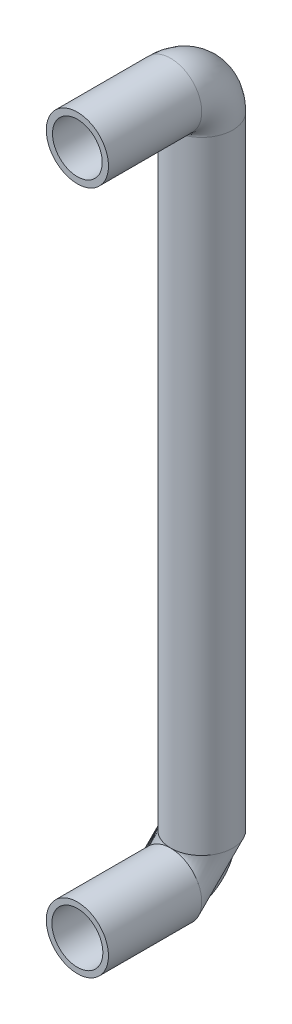
ISO-10303-21;
HEADER;
FILE_DESCRIPTION(('STEP AP214'),'2;1');
FILE_NAME('part.step','',(''),(''),'','','');
FILE_SCHEMA(('AUTOMOTIVE_DESIGN { 1 0 10303 214 1 1 1 1 }'));
ENDSEC;
DATA;
#1=APPLICATION_CONTEXT('core data for automotive mechanical design processes');
#2=APPLICATION_PROTOCOL_DEFINITION('international standard','automotive_design',2000,#1);
#3=PRODUCT_CONTEXT('',#1,'mechanical');
#4=PRODUCT('Part','Part','',(#3));
#5=PRODUCT_RELATED_PRODUCT_CATEGORY('part','',(#4));
#6=PRODUCT_DEFINITION_FORMATION('','',#4);
#7=PRODUCT_DEFINITION_CONTEXT('part definition',#1,'design');
#8=PRODUCT_DEFINITION('design','',#6,#7);
#9=PRODUCT_DEFINITION_SHAPE('','',#8);
#10=(LENGTH_UNIT() NAMED_UNIT(*) SI_UNIT(.MILLI.,.METRE.));
#11=(NAMED_UNIT(*) PLANE_ANGLE_UNIT() SI_UNIT($,.RADIAN.));
#12=(NAMED_UNIT(*) SI_UNIT($,.STERADIAN.) SOLID_ANGLE_UNIT());
#13=UNCERTAINTY_MEASURE_WITH_UNIT(LENGTH_MEASURE(1.E-05),#10,'distance_accuracy_value','');
#14=(GEOMETRIC_REPRESENTATION_CONTEXT(3) GLOBAL_UNCERTAINTY_ASSIGNED_CONTEXT((#13)) GLOBAL_UNIT_ASSIGNED_CONTEXT((#10,
#11,#12)) REPRESENTATION_CONTEXT('',''));
#15=CARTESIAN_POINT('',(0.,0.,0.));
#16=DIRECTION('',(0.,0.,1.));
#17=DIRECTION('',(1.,0.,0.));
#18=AXIS2_PLACEMENT_3D('',#15,#16,#17);
#19=CARTESIAN_POINT('',(0.,0.,0.));
#20=DIRECTION('',(0.,0.,1.));
#21=DIRECTION('',(1.,0.,0.));
#22=AXIS2_PLACEMENT_3D('',#19,#20,#21);
#23=PLANE('',#22);
#24=CARTESIAN_POINT('',(0.,0.,0.));
#25=DIRECTION('',(0.,0.,1.));
#26=DIRECTION('',(1.,0.,0.));
#27=AXIS2_PLACEMENT_3D('',#24,#25,#26);
#28=CIRCLE('',#27,4.);
#29=CARTESIAN_POINT('',(4.,0.,0.));
#30=VERTEX_POINT('',#29);
#31=EDGE_CURVE('E77',#30,#30,#28,.T.);
#32=ORIENTED_EDGE('',*,*,#31,.F.);
#33=EDGE_LOOP('',(#32));
#34=FACE_BOUND('',#33,.T.);
#35=CARTESIAN_POINT('',(0.,0.,0.));
#36=DIRECTION('',(0.,0.,1.));
#37=DIRECTION('',(1.,0.,0.));
#38=AXIS2_PLACEMENT_3D('',#35,#36,#37);
#39=CIRCLE('',#38,5.);
#40=CARTESIAN_POINT('',(5.,0.,0.));
#41=VERTEX_POINT('',#40);
#42=EDGE_CURVE('E88',#41,#41,#39,.T.);
#43=ORIENTED_EDGE('',*,*,#42,.T.);
#44=EDGE_LOOP('',(#43));
#45=FACE_BOUND('',#44,.T.);
#46=ADVANCED_FACE('F39',(#34,#45),#23,.T.);
#47=CARTESIAN_POINT('',(0.,-110.,0.));
#48=DIRECTION('',(0.,0.,-1.));
#49=DIRECTION('',(1.,0.,0.));
#50=AXIS2_PLACEMENT_3D('',#47,#48,#49);
#51=PLANE('',#50);
#52=CARTESIAN_POINT('',(0.,-110.,0.));
#53=DIRECTION('',(0.,0.,1.));
#54=DIRECTION('',(1.,0.,0.));
#55=AXIS2_PLACEMENT_3D('',#52,#53,#54);
#56=CIRCLE('',#55,4.1);
#57=CARTESIAN_POINT('',(4.1,-110.,0.));
#58=VERTEX_POINT('',#57);
#59=EDGE_CURVE('E78',#58,#58,#56,.T.);
#60=ORIENTED_EDGE('',*,*,#59,.F.);
#61=EDGE_LOOP('',(#60));
#62=FACE_BOUND('',#61,.T.);
#63=CARTESIAN_POINT('',(0.,-110.,0.));
#64=DIRECTION('',(0.,0.,-1.));
#65=DIRECTION('',(1.,0.,0.));
#66=AXIS2_PLACEMENT_3D('',#63,#64,#65);
#67=CIRCLE('',#66,5.);
#68=CARTESIAN_POINT('',(5.,-110.,0.));
#69=VERTEX_POINT('',#68);
#70=EDGE_CURVE('E73',#69,#69,#67,.T.);
#71=ORIENTED_EDGE('',*,*,#70,.F.);
#72=EDGE_LOOP('',(#71));
#73=FACE_BOUND('',#72,.T.);
#74=ADVANCED_FACE('F148',(#62,#73),#51,.F.);
#75=CARTESIAN_POINT('',(0.,0.,0.));
#76=DIRECTION('',(0.,0.,-1.));
#77=DIRECTION('',(-1.,0.,0.));
#78=AXIS2_PLACEMENT_3D('',#75,#76,#77);
#79=CYLINDRICAL_SURFACE('',#78,5.);
#80=CARTESIAN_POINT('',(0.,0.,-15.));
#81=DIRECTION('',(0.,0.,1.));
#82=DIRECTION('',(1.,0.,0.));
#83=AXIS2_PLACEMENT_3D('',#80,#81,#82);
#84=CIRCLE('',#83,5.);
#85=CARTESIAN_POINT('',(0.,-5.,-15.));
#86=VERTEX_POINT('',#85);
#87=EDGE_CURVE('E64',#86,#86,#84,.T.);
#88=ORIENTED_EDGE('',*,*,#87,.T.);
#89=EDGE_LOOP('',(#88));
#90=FACE_BOUND('',#89,.T.);
#91=ORIENTED_EDGE('',*,*,#42,.F.);
#92=EDGE_LOOP('',(#91));
#93=FACE_BOUND('',#92,.T.);
#94=ADVANCED_FACE('F150',(#90,#93),#79,.T.);
#95=CARTESIAN_POINT('',(0.,-5.,-9.99999999999999));
#96=DIRECTION('',(0.,-1.,0.));
#97=DIRECTION('',(0.,0.,1.));
#98=AXIS2_PLACEMENT_3D('',#95,#96,#97);
#99=CIRCLE('',#98,5.);
#100=TRIMMED_CURVE('',#99,(PARAMETER_VALUE(-3.14159263251637)),
(PARAMETER_VALUE(3.14159263251637)),.T.,.PARAMETER.);
#101=CARTESIAN_POINT('',(0.,-5.,-15.));
#102=DIRECTION('',(-1.,0.,0.));
#103=AXIS1_PLACEMENT('',#101,#102);
#104=SURFACE_OF_REVOLUTION('',#100,#103);
#105=CARTESIAN_POINT('',(0.,-5.00000000000003,-20.));
#106=DIRECTION('',(0.,1.,0.));
#107=DIRECTION('',(1.,0.,0.));
#108=AXIS2_PLACEMENT_3D('',#105,#106,#107);
#109=CIRCLE('',#108,5.);
#110=EDGE_CURVE('E103',#86,#86,#109,.T.);
#111=ORIENTED_EDGE('',*,*,#110,.T.);
#112=ORIENTED_EDGE('',*,*,#87,.F.);
#113=EDGE_LOOP('',(#111,#112));
#114=FACE_BOUND('',#113,.T.);
#115=ADVANCED_FACE('F156',(#114),#104,.T.);
#116=CARTESIAN_POINT('',(0.,-5.00000000000003,-20.));
#117=DIRECTION('',(0.,-1.,0.));
#118=DIRECTION('',(0.,0.,-1.));
#119=AXIS2_PLACEMENT_3D('',#116,#117,#118);
#120=CYLINDRICAL_SURFACE('',#119,5.);
#121=CARTESIAN_POINT('',(0.,-105.,-20.));
#122=DIRECTION('',(0.,1.,0.));
#123=DIRECTION('',(1.,0.,0.));
#124=AXIS2_PLACEMENT_3D('',#121,#122,#123);
#125=CIRCLE('',#124,5.);
#126=CARTESIAN_POINT('',(0.,-105.,-15.));
#127=VERTEX_POINT('',#126);
#128=EDGE_CURVE('E105',#127,#127,#125,.T.);
#129=ORIENTED_EDGE('',*,*,#128,.T.);
#130=EDGE_LOOP('',(#129));
#131=FACE_BOUND('',#130,.T.);
#132=ORIENTED_EDGE('',*,*,#110,.F.);
#133=EDGE_LOOP('',(#132));
#134=FACE_BOUND('',#133,.T.);
#135=ADVANCED_FACE('F143',(#131,#134),#120,.T.);
#136=CARTESIAN_POINT('',(0.,-105.,-15.));
#137=DIRECTION('',(-1.,0.,0.));
#138=DIRECTION('',(0.,0.,1.));
#139=AXIS2_PLACEMENT_3D('',#136,#137,#138);
#140=TOROIDAL_SURFACE('',#139,5.,5.);
#141=CARTESIAN_POINT('',(0.,-110.,-15.));
#142=DIRECTION('',(0.,0.,-1.));
#143=DIRECTION('',(1.,0.,0.));
#144=AXIS2_PLACEMENT_3D('',#141,#142,#143);
#145=CIRCLE('',#144,5.);
#146=EDGE_CURVE('E108',#127,#127,#145,.T.);
#147=ORIENTED_EDGE('',*,*,#146,.T.);
#148=ORIENTED_EDGE('',*,*,#128,.F.);
#149=EDGE_LOOP('',(#147,#148));
#150=FACE_BOUND('',#149,.T.);
#151=ADVANCED_FACE('F137',(#150),#140,.T.);
#152=CARTESIAN_POINT('',(0.,-110.,-15.));
#153=DIRECTION('',(0.,0.,1.));
#154=DIRECTION('',(1.,0.,0.));
#155=AXIS2_PLACEMENT_3D('',#152,#153,#154);
#156=CYLINDRICAL_SURFACE('',#155,5.);
#157=ORIENTED_EDGE('',*,*,#70,.T.);
#158=EDGE_LOOP('',(#157));
#159=FACE_BOUND('',#158,.T.);
#160=ORIENTED_EDGE('',*,*,#146,.F.);
#161=EDGE_LOOP('',(#160));
#162=FACE_BOUND('',#161,.T.);
#163=ADVANCED_FACE('F128',(#159,#162),#156,.T.);
#164=CARTESIAN_POINT('',(0.,0.,0.));
#165=DIRECTION('',(0.,0.,-1.));
#166=DIRECTION('',(-1.,0.,0.));
#167=AXIS2_PLACEMENT_3D('',#164,#165,#166);
#168=CYLINDRICAL_SURFACE('',#167,4.);
#169=CARTESIAN_POINT('',(0.,0.,-15.));
#170=DIRECTION('',(0.,0.,-1.));
#171=DIRECTION('',(-1.,0.,0.));
#172=AXIS2_PLACEMENT_3D('',#169,#170,#171);
#173=CIRCLE('',#172,4.);
#174=CARTESIAN_POINT('',(0.,4.,-15.));
#175=VERTEX_POINT('',#174);
#176=EDGE_CURVE('E94',#175,#175,#173,.F.);
#177=ORIENTED_EDGE('',*,*,#176,.F.);
#178=EDGE_LOOP('',(#177));
#179=FACE_BOUND('',#178,.T.);
#180=ORIENTED_EDGE('',*,*,#31,.T.);
#181=EDGE_LOOP('',(#180));
#182=FACE_BOUND('',#181,.T.);
#183=ADVANCED_FACE('F124',(#179,#182),#168,.F.);
#184=CARTESIAN_POINT('',(0.,-5.,-15.));
#185=DIRECTION('',(-1.,0.,0.));
#186=DIRECTION('',(0.,0.,1.));
#187=AXIS2_PLACEMENT_3D('',#184,#185,#186);
#188=TOROIDAL_SURFACE('',#187,5.,4.);
#189=CARTESIAN_POINT('',(0.,-5.00000000000003,-20.));
#190=DIRECTION('',(0.,1.,0.));
#191=DIRECTION('',(0.,0.,1.));
#192=AXIS2_PLACEMENT_3D('',#189,#190,#191);
#193=CIRCLE('',#192,4.);
#194=CARTESIAN_POINT('',(0.,-5.00000000000006,-24.));
#195=VERTEX_POINT('',#194);
#196=EDGE_CURVE('E89',#195,#195,#193,.T.);
#197=CARTESIAN_POINT('',(0.,-5.,-15.));
#198=DIRECTION('',(-1.,0.,0.));
#199=DIRECTION('',(0.,0.,1.));
#200=AXIS2_PLACEMENT_3D('',#197,#198,#199);
#201=CIRCLE('',#200,9.);
#202=EDGE_CURVE('',#175,#195,#201,.T.);
#203=ORIENTED_EDGE('',*,*,#176,.T.);
#204=ORIENTED_EDGE('',*,*,#196,.F.);
#205=ORIENTED_EDGE('',*,*,#202,.T.);
#206=ORIENTED_EDGE('',*,*,#202,.F.);
#207=EDGE_LOOP('',(#203,#205,#204,#206));
#208=FACE_BOUND('',#207,.T.);
#209=ADVANCED_FACE('F127',(#208),#188,.F.);
#210=CARTESIAN_POINT('',(0.,-5.00000000000003,-20.));
#211=DIRECTION('',(0.,-1.,0.));
#212=DIRECTION('',(0.,0.,-1.));
#213=AXIS2_PLACEMENT_3D('',#210,#211,#212);
#214=CYLINDRICAL_SURFACE('',#213,4.);
#215=CARTESIAN_POINT('',(0.,-105.,-20.));
#216=DIRECTION('',(0.,-1.,0.));
#217=DIRECTION('',(0.,0.,-1.));
#218=AXIS2_PLACEMENT_3D('',#215,#216,#217);
#219=CIRCLE('',#218,4.);
#220=CARTESIAN_POINT('',(0.,-105.,-24.));
#221=VERTEX_POINT('',#220);
#222=EDGE_CURVE('E86',#221,#221,#219,.F.);
#223=ORIENTED_EDGE('',*,*,#222,.F.);
#224=EDGE_LOOP('',(#223));
#225=FACE_BOUND('',#224,.T.);
#226=ORIENTED_EDGE('',*,*,#196,.T.);
#227=EDGE_LOOP('',(#226));
#228=FACE_BOUND('',#227,.T.);
#229=ADVANCED_FACE('F83',(#225,#228),#214,.F.);
#230=CARTESIAN_POINT('',(0.,-105.,-15.));
#231=DIRECTION('',(-1.,0.,0.));
#232=DIRECTION('',(0.,0.,1.));
#233=AXIS2_PLACEMENT_3D('',#230,#231,#232);
#234=TOROIDAL_SURFACE('',#233,5.,4.);
#235=CARTESIAN_POINT('',(-3.95454413177491,-108.917604180605,-17.0002));
#236=CARTESIAN_POINT('',(-3.94818848563866,-108.89438807795,-16.953642394314));
#237=CARTESIAN_POINT('',(-3.94095379089389,-108.86875336566,-16.9084355831934));
#238=CARTESIAN_POINT('',(-3.92460820201643,-108.81328750389,-16.8211814074797));
#239=CARTESIAN_POINT('',(-3.91550165777664,-108.783466133606,-16.7791270209259));
#240=CARTESIAN_POINT('',(-3.89545771350398,-108.720754584002,-16.6991817434946));
#241=CARTESIAN_POINT('',(-3.88455820982037,-108.68793313527,-16.6612271372136));
#242=CARTESIAN_POINT('',(-3.86075541118162,-108.619462746031,-16.58862358843));
#243=CARTESIAN_POINT('',(-3.8478510070753,-108.58381224581,-16.5539764929416));
#244=CARTESIAN_POINT('',(-3.81665367836932,-108.501491094993,-16.4798684800234));
#245=CARTESIAN_POINT('',(-3.79781299618077,-108.454245242968,-16.4412790391153));
#246=CARTESIAN_POINT('',(-3.75707146581952,-108.357695665534,-16.368570377362));
#247=CARTESIAN_POINT('',(-3.73516967056883,-108.308391306566,-16.3344525463432));
#248=CARTESIAN_POINT('',(-3.68821781799595,-108.208317382169,-16.2698691811642));
#249=CARTESIAN_POINT('',(-3.66314563708169,-108.157539667405,-16.2394325802704));
#250=CARTESIAN_POINT('',(-3.61007309779777,-108.055602896809,-16.1819214993274));
#251=CARTESIAN_POINT('',(-3.58207165087479,-108.004443705821,-16.1548482773878));
#252=CARTESIAN_POINT('',(-3.50718205506897,-107.874451357578,-16.0895485273117));
#253=CARTESIAN_POINT('',(-3.45832662788634,-107.795752790809,-16.0532988152816));
#254=CARTESIAN_POINT('',(-3.35421955832444,-107.640343783318,-15.9860818816814));
#255=CARTESIAN_POINT('',(-3.29896485233965,-107.563634316549,-15.9551172079767));
#256=CARTESIAN_POINT('',(-3.18250627246222,-107.413365377685,-15.8974158627727));
#257=CARTESIAN_POINT('',(-3.12130946485582,-107.339802310386,-15.8706742663073));
#258=CARTESIAN_POINT('',(-2.99326569349928,-107.196501995485,-15.8205769767032));
#259=CARTESIAN_POINT('',(-2.92641663152792,-107.126766184612,-15.7972225497573));
#260=CARTESIAN_POINT('',(-2.78503400946434,-106.989413393208,-15.7525750726964));
#261=CARTESIAN_POINT('',(-2.71031342363226,-106.921955901259,-15.7313827288043));
#262=CARTESIAN_POINT('',(-2.55569261927913,-106.792411245427,-15.6915925491157));
#263=CARTESIAN_POINT('',(-2.47579074319653,-106.730325815112,-15.6729955496609));
#264=CARTESIAN_POINT('',(-2.22903862250979,-106.552922830879,-15.6206389891985));
#265=CARTESIAN_POINT('',(-2.05503028886098,-106.446349885905,-15.5902801062245));
#266=CARTESIAN_POINT('',(-1.67398410911682,-106.250577123917,-15.5348836051867));
#267=CARTESIAN_POINT('',(-1.46538355255861,-106.164183757674,-15.5106827062036));
#268=CARTESIAN_POINT('',(-1.0359573730722,-106.026636159141,-15.4719593434432));
#269=CARTESIAN_POINT('',(-0.815129967773373,-105.97548707928,-15.457438294792));
#270=CARTESIAN_POINT('',(-0.369229273273451,-105.910494434565,-15.4389230791205));
#271=CARTESIAN_POINT('',(-0.144197952126386,-105.896385167866,-15.4348539408145));
#272=CARTESIAN_POINT('',(0.305027599064916,-105.905192189977,-15.4373781593157));
#273=CARTESIAN_POINT('',(0.529221913679403,-105.928104630778,-15.4439704079863));
#274=CARTESIAN_POINT('',(0.96768533444738,-106.009682404188,-15.4671370182876));
#275=CARTESIAN_POINT('',(1.18204291573129,-106.067901919249,-15.483586878968));
#276=CARTESIAN_POINT('',(1.49367584391109,-106.18015781533,-15.5151657741392));
#277=CARTESIAN_POINT('',(1.5959597976152,-106.221762505008,-15.526851609542));
#278=CARTESIAN_POINT('',(1.79659657637079,-106.312947060966,-15.5525317789049));
#279=CARTESIAN_POINT('',(1.89495074965782,-106.36252416221,-15.5665253125394));
#280=CARTESIAN_POINT('',(2.08840506276159,-106.469988204576,-15.5971010568895));
#281=CARTESIAN_POINT('',(2.18344104151881,-106.527980989138,-15.6137165196978));
#282=CARTESIAN_POINT('',(2.36811942252453,-106.651220132009,-15.6495696458292));
#283=CARTESIAN_POINT('',(2.45776365697957,-106.716464004565,-15.6688064110492));
#284=CARTESIAN_POINT('',(2.63109415394775,-106.853642825109,-15.7102352605281));
#285=CARTESIAN_POINT('',(2.71477858050853,-106.925579819345,-15.7324282494765));
#286=CARTESIAN_POINT('',(2.87555530711874,-107.07540634271,-15.7802674704755));
#287=CARTESIAN_POINT('',(2.95264893761717,-107.153294664436,-15.8059130028753));
#288=CARTESIAN_POINT('',(3.08585045016775,-107.299008212554,-15.856196537047));
#289=CARTESIAN_POINT('',(3.14317792179562,-107.365970173964,-15.8801165318427));
#290=CARTESIAN_POINT('',(3.25282796113315,-107.502645144728,-15.931312755304));
#291=CARTESIAN_POINT('',(3.30515137909677,-107.57235768387,-15.9585884119916));
#292=CARTESIAN_POINT('',(3.40448658021819,-107.713752366038,-16.0172593633242));
#293=CARTESIAN_POINT('',(3.45150145923413,-107.785433330464,-16.0486522335399));
#294=CARTESIAN_POINT('',(3.5399458701563,-107.929748791484,-16.116603567168));
#295=CARTESIAN_POINT('',(3.58137843007467,-108.002382747491,-16.1531592079219));
#296=CARTESIAN_POINT('',(3.66466509410685,-108.158994440911,-16.2392769887222));
#297=CARTESIAN_POINT('',(3.70549479524195,-108.242898656354,-16.2899872857998));
#298=CARTESIAN_POINT('',(3.7786359249739,-108.406312177824,-16.4026754251421));
#299=CARTESIAN_POINT('',(3.81099262487508,-108.485842969574,-16.4645902659948));
#300=CARTESIAN_POINT('',(3.85233078401078,-108.596076514231,-16.5657537479919));
#301=CARTESIAN_POINT('',(3.86463912250969,-108.630405771554,-16.599730197065));
#302=CARTESIAN_POINT('',(3.88737440551849,-108.696340351817,-16.6708084845829));
#303=CARTESIAN_POINT('',(3.89780214693779,-108.727946825566,-16.7079089893754));
#304=CARTESIAN_POINT('',(3.91698677559727,-108.788291000422,-16.7858231944633));
#305=CARTESIAN_POINT('',(3.92571294024261,-108.816972150989,-16.8266884491842));
#306=CARTESIAN_POINT('',(3.94141695174582,-108.870395744152,-16.9113450961832));
#307=CARTESIAN_POINT('',(3.94839131246193,-108.895130297797,-16.9551421069061));
#308=CARTESIAN_POINT('',(3.95454413177491,-108.917604180605,-17.0002));
#309=B_SPLINE_CURVE_WITH_KNOTS('',3,(#235,#236,#237,#238,#239,#240,#241,#242,#243,#244,#245,
#246,#247,#248,#249,#250,#251,#252,#253,#254,#255,#256,#257,#258,#259,#260,#261,#262,#263,#264,
#265,#266,#267,#268,#269,#270,#271,#272,#273,#274,#275,#276,#277,#278,#279,#280,#281,#282,#283,
#284,#285,#286,#287,#288,#289,#290,#291,#292,#293,#294,#295,#296,#297,#298,#299,#300,#301,#302,
#303,#304,#305,#306,#307,#308),.UNSPECIFIED.,.F.,.F.,(4,2,2,2,2,2,2,2,2,2,2,2,2,2,2,2,2,2,2,2,2,
2,2,2,2,2,2,2,2,2,2,2,2,2,2,2,4),(0.,0.157125596088075,0.313890102603698,0.467688860959516,
0.621573008850485,0.81279154474458,1.00406937325907,1.19676440493076,1.38953130068172,
1.68750242333374,1.9856167916866,2.28338088899904,2.58125601126318,2.88955264114938,
3.19794839038134,3.81426670584004,4.49227113952547,5.17037467096421,5.8436004240061,
6.51675620696169,7.1815841579565,7.51438741559671,7.84707549657716,8.1843838845794,
8.52157699419174,8.85887353270637,9.19610182138971,9.46989187780012,9.74363533075029,
10.0172183070645,10.290652281379,10.6084946465488,10.92460242968,11.0739602373604,
11.2232546046812,11.3750356159692,11.5271163246554),.UNSPECIFIED.);
#310=CARTESIAN_POINT('',(-3.95451675329131,-108.917504158004,-17.));
#311=VERTEX_POINT('',#310);
#312=CARTESIAN_POINT('',(3.9545167532885,-108.917504157983,-17.));
#313=VERTEX_POINT('',#312);
#314=EDGE_CURVE('E11',#311,#313,#309,.T.);
#315=ORIENTED_EDGE('',*,*,#314,.F.);
#316=CARTESIAN_POINT('',(0.,-113.774964387392,-17.));
#317=CARTESIAN_POINT('',(0.109931124173168,-113.774963736503,-17.));
#318=CARTESIAN_POINT('',(0.219883012109982,-113.770312130353,-17.));
#319=CARTESIAN_POINT('',(0.439044666345319,-113.751735655026,-17.));
#320=CARTESIAN_POINT('',(0.548254033342025,-113.73780614219,-17.));
#321=CARTESIAN_POINT('',(0.76529720049584,-113.700745301192,-17.));
#322=CARTESIAN_POINT('',(0.873128304865974,-113.677598151964,-17.));
#323=CARTESIAN_POINT('',(1.08648861618414,-113.622272656926,-17.));
#324=CARTESIAN_POINT('',(1.192016934421,-113.590090888581,-17.));
#325=CARTESIAN_POINT('',(1.39983059258533,-113.516998394943,-17.));
#326=CARTESIAN_POINT('',(1.50212067945507,-113.476101197724,-17.));
#327=CARTESIAN_POINT('',(1.70292191509582,-113.385869848719,-17.));
#328=CARTESIAN_POINT('',(1.80143165820515,-113.336532595144,-17.));
#329=CARTESIAN_POINT('',(2.09007485494176,-113.176474173662,-17.));
#330=CARTESIAN_POINT('',(2.27364828769078,-113.053591136592,-17.));
#331=CARTESIAN_POINT('',(2.61912929113364,-112.778269954152,-17.));
#332=CARTESIAN_POINT('',(2.78086863039665,-112.625622276567,-17.));
#333=CARTESIAN_POINT('',(3.0771360450821,-112.295819657762,-17.));
#334=CARTESIAN_POINT('',(3.21165816623712,-112.118659368199,-17.));
#335=CARTESIAN_POINT('',(3.45303452649739,-111.740805634347,-17.));
#336=CARTESIAN_POINT('',(3.55919780919953,-111.539672230492,-17.));
#337=CARTESIAN_POINT('',(3.73776540989583,-111.122946431597,-17.));
#338=CARTESIAN_POINT('',(3.81017550210314,-110.90735651688,-17.));
#339=CARTESIAN_POINT('',(3.8941739187935,-110.5729815419,-17.));
#340=CARTESIAN_POINT('',(3.9182905733236,-110.457181663052,-17.));
#341=CARTESIAN_POINT('',(3.95725340334441,-110.224039619116,-17.));
#342=CARTESIAN_POINT('',(3.97210191169453,-110.106697849733,-17.));
#343=CARTESIAN_POINT('',(3.99269184306665,-109.871087425252,-17.));
#344=CARTESIAN_POINT('',(3.99842219756301,-109.75281781851,-17.));
#345=CARTESIAN_POINT('',(4.00101024121206,-109.516212890126,-17.));
#346=CARTESIAN_POINT('',(3.9978693123085,-109.397877581589,-17.));
#347=CARTESIAN_POINT('',(3.98053514927931,-109.121246033543,-17.));
#348=CARTESIAN_POINT('',(3.96292218277281,-108.963157442386,-17.));
#349=CARTESIAN_POINT('',(3.91350393898837,-108.649218069096,-17.));
#350=CARTESIAN_POINT('',(3.881694495503,-108.493367957752,-17.));
#351=CARTESIAN_POINT('',(3.80546685112533,-108.185072483976,-17.));
#352=CARTESIAN_POINT('',(3.76106791126471,-108.032622301275,-17.));
#353=CARTESIAN_POINT('',(3.66155467368272,-107.731341030421,-17.));
#354=CARTESIAN_POINT('',(3.60644225463534,-107.582509312889,-17.));
#355=CARTESIAN_POINT('',(3.49239636974361,-107.299337588052,-17.));
#356=CARTESIAN_POINT('',(3.43406447469389,-107.164751130324,-17.));
#357=CARTESIAN_POINT('',(3.31277392937029,-106.897641210085,-17.));
#358=CARTESIAN_POINT('',(3.24981309941865,-106.765118755529,-17.));
#359=CARTESIAN_POINT('',(3.15444566894867,-106.566376095585,-17.));
#360=CARTESIAN_POINT('',(3.12241972933025,-106.499966961819,-17.));
#361=CARTESIAN_POINT('',(3.05875424174056,-106.36696445954,-17.));
#362=CARTESIAN_POINT('',(3.02711467841923,-106.300371098476,-17.));
#363=CARTESIAN_POINT('',(2.96503384420451,-106.166674646592,-17.));
#364=CARTESIAN_POINT('',(2.93459181189475,-106.099571913117,-17.));
#365=CARTESIAN_POINT('',(2.87593560004762,-105.964406679672,-17.));
#366=CARTESIAN_POINT('',(2.84772078665352,-105.896344459314,-17.));
#367=CARTESIAN_POINT('',(2.79604899817683,-105.761876994186,-17.));
#368=CARTESIAN_POINT('',(2.77243618166211,-105.695532774652,-17.));
#369=CARTESIAN_POINT('',(2.72997410915795,-105.561303504693,-17.));
#370=CARTESIAN_POINT('',(2.71112445415957,-105.493418583852,-17.));
#371=CARTESIAN_POINT('',(2.68010135738254,-105.357196070883,-17.));
#372=CARTESIAN_POINT('',(2.66782923995905,-105.288881688384,-17.));
#373=CARTESIAN_POINT('',(2.65092976201248,-105.151311603347,-17.));
#374=CARTESIAN_POINT('',(2.64629854387228,-105.082056393617,-17.));
#375=CARTESIAN_POINT('',(2.6452918256055,-104.942833083103,-17.));
#376=CARTESIAN_POINT('',(2.648994114557,-104.872864384774,-17.));
#377=CARTESIAN_POINT('',(2.66430394119577,-104.73380224074,-17.));
#378=CARTESIAN_POINT('',(2.67591502292474,-104.664709201575,-17.));
#379=CARTESIAN_POINT('',(2.7059291109008,-104.526748580309,-17.));
#380=CARTESIAN_POINT('',(2.72445167191937,-104.457907896686,-17.));
#381=CARTESIAN_POINT('',(2.76652358258931,-104.321815077965,-17.));
#382=CARTESIAN_POINT('',(2.79007351115333,-104.254563126805,-17.));
#383=CARTESIAN_POINT('',(2.83782196330234,-104.128799372314,-17.));
#384=CARTESIAN_POINT('',(2.8616575494985,-104.070146851099,-17.));
#385=CARTESIAN_POINT('',(2.91117912981063,-103.953622853421,-17.));
#386=CARTESIAN_POINT('',(2.93686547459061,-103.89575152745,-17.));
#387=CARTESIAN_POINT('',(3.01562584450579,-103.722804364386,-17.));
#388=CARTESIAN_POINT('',(3.07035997346021,-103.608495958741,-17.));
#389=CARTESIAN_POINT('',(3.18025422964055,-103.379814098951,-17.));
#390=CARTESIAN_POINT('',(3.23541499429451,-103.265440980314,-17.));
#391=CARTESIAN_POINT('',(3.34337068911967,-103.035633423601,-17.));
#392=CARTESIAN_POINT('',(3.3961668253013,-102.920199563582,-17.));
#393=CARTESIAN_POINT('',(3.49680396392088,-102.689049620963,-17.));
#394=CARTESIAN_POINT('',(3.54470295637217,-102.573359084331,-17.));
#395=CARTESIAN_POINT('',(3.6349477709847,-102.339786449487,-17.));
#396=CARTESIAN_POINT('',(3.67729257941517,-102.221903955678,-17.));
#397=CARTESIAN_POINT('',(3.75521844673149,-101.984074370104,-17.));
#398=CARTESIAN_POINT('',(3.79080820014232,-101.864130151996,-17.));
#399=CARTESIAN_POINT('',(3.85433286690359,-101.622251384833,-17.));
#400=CARTESIAN_POINT('',(3.88226991525224,-101.500317400976,-17.));
#401=CARTESIAN_POINT('',(3.93024966492036,-101.252004145686,-17.));
#402=CARTESIAN_POINT('',(3.95009787370329,-101.125586905261,-17.));
#403=CARTESIAN_POINT('',(3.98026826035708,-100.871620002166,-17.));
#404=CARTESIAN_POINT('',(3.99059134350637,-100.744070448276,-17.));
#405=CARTESIAN_POINT('',(4.00120070846328,-100.487504521552,-17.));
#406=CARTESIAN_POINT('',(4.00140485251832,-100.358484645583,-17.));
#407=CARTESIAN_POINT('',(3.99114054991671,-100.100823048633,-17.));
#408=CARTESIAN_POINT('',(3.98066908053194,-99.9721814451034,-17.));
#409=CARTESIAN_POINT('',(3.94872509764987,-99.7159245040016,-17.));
#410=CARTESIAN_POINT('',(3.92722427197453,-99.5883126703599,-17.));
#411=CARTESIAN_POINT('',(3.87306933016531,-99.3354776006185,-17.));
#412=CARTESIAN_POINT('',(3.84041591410413,-99.2102542151114,-17.));
#413=CARTESIAN_POINT('',(3.76408011521465,-98.963621617911,-17.));
#414=CARTESIAN_POINT('',(3.72043118955318,-98.8422020698702,-17.));
#415=CARTESIAN_POINT('',(3.62221021529632,-98.6038607501785,-17.));
#416=CARTESIAN_POINT('',(3.56763862325353,-98.486938790778,-17.));
#417=CARTESIAN_POINT('',(3.4512963027603,-98.2651948531924,-17.));
#418=CARTESIAN_POINT('',(3.39011521951396,-98.1600632403647,-17.));
#419=CARTESIAN_POINT('',(3.25864529528515,-97.9555986903654,-17.));
#420=CARTESIAN_POINT('',(3.18835327837954,-97.8562677928251,-17.));
#421=CARTESIAN_POINT('',(3.03912464134712,-97.6642776101619,-17.));
#422=CARTESIAN_POINT('',(2.96018549913739,-97.5716202846323,-17.));
#423=CARTESIAN_POINT('',(2.79421458715514,-97.393792555386,-17.));
#424=CARTESIAN_POINT('',(2.70717995901847,-97.3086248169087,-17.));
#425=CARTESIAN_POINT('',(2.53103870189851,-97.1513400788553,-17.));
#426=CARTESIAN_POINT('',(2.44235360123798,-97.0787504606618,-17.));
#427=CARTESIAN_POINT('',(2.25901063733894,-96.9414739610978,-17.));
#428=CARTESIAN_POINT('',(2.16435065379406,-96.8767899093579,-17.));
#429=CARTESIAN_POINT('',(1.96984936514259,-96.755932050774,-17.));
#430=CARTESIAN_POINT('',(1.8700122401379,-96.6997515173954,-17.));
#431=CARTESIAN_POINT('',(1.66578496570152,-96.5962805535267,-17.));
#432=CARTESIAN_POINT('',(1.56139317835915,-96.5489933541947,-17.));
#433=CARTESIAN_POINT('',(1.35188507835492,-96.4649337538321,-17.));
#434=CARTESIAN_POINT('',(1.24687290956004,-96.4279016163171,-17.));
#435=CARTESIAN_POINT('',(1.03403838486114,-96.3629024111294,-17.));
#436=CARTESIAN_POINT('',(0.926215022180145,-96.3349386406742,-17.));
#437=CARTESIAN_POINT('',(0.70860836709347,-96.2883264206948,-17.));
#438=CARTESIAN_POINT('',(0.598825841548839,-96.2696744057234,-17.));
#439=CARTESIAN_POINT('',(0.378058652752166,-96.2418054350232,-17.));
#440=CARTESIAN_POINT('',(0.267073563056713,-96.2325919448555,-17.));
#441=CARTESIAN_POINT('',(-0.0636679680816013,-96.219385582997,-17.));
#442=CARTESIAN_POINT('',(-0.284142429554051,-96.2292044860638,-17.));
#443=CARTESIAN_POINT('',(-0.720168525569898,-96.2857861690889,-17.));
#444=CARTESIAN_POINT('',(-0.935720321105692,-96.3325477390774,-17.));
#445=CARTESIAN_POINT('',(-1.35563341451527,-96.4614532558795,-17.));
#446=CARTESIAN_POINT('',(-1.56001122557699,-96.5435433079043,-17.));
#447=CARTESIAN_POINT('',(-1.95221882935947,-96.7405983016861,-17.));
#448=CARTESIAN_POINT('',(-2.14004895648049,-96.855562578912,-17.));
#449=CARTESIAN_POINT('',(-2.49560322937613,-97.115986429787,-17.));
#450=CARTESIAN_POINT('',(-2.66314860967112,-97.2616898966693,-17.));
#451=CARTESIAN_POINT('',(-2.97200559463216,-97.5786773738975,-17.));
#452=CARTESIAN_POINT('',(-3.11331201600603,-97.749966426434,-17.));
#453=CARTESIAN_POINT('',(-3.36895903232611,-98.1168725969306,-17.));
#454=CARTESIAN_POINT('',(-3.48267965860039,-98.3129205546976,-17.));
#455=CARTESIAN_POINT('',(-3.67694674610916,-98.7207645492843,-17.));
#456=CARTESIAN_POINT('',(-3.75750571491577,-98.9325546130111,-17.));
#457=CARTESIAN_POINT('',(-3.85400382655085,-99.2617995358035,-17.));
#458=CARTESIAN_POINT('',(-3.88240296042422,-99.3757668407759,-17.));
#459=CARTESIAN_POINT('',(-3.93002111026208,-99.6055960871536,-17.));
#460=CARTESIAN_POINT('',(-3.94924253903745,-99.7214575223003,-17.));
#461=CARTESIAN_POINT('',(-3.97863152369873,-99.9545243174985,-17.));
#462=CARTESIAN_POINT('',(-3.98878249305618,-100.07173174424,-17.));
#463=CARTESIAN_POINT('',(-4.00018194861535,-100.306544412514,-17.));
#464=CARTESIAN_POINT('',(-4.00143249554149,-100.424149555654,-17.));
#465=CARTESIAN_POINT('',(-3.99509547001087,-100.668602401415,-17.));
#466=CARTESIAN_POINT('',(-3.98678759901478,-100.795431240119,-17.));
#467=CARTESIAN_POINT('',(-3.96065811395532,-101.048069892763,-17.));
#468=CARTESIAN_POINT('',(-3.94283799180474,-101.173879863362,-17.));
#469=CARTESIAN_POINT('',(-3.89842617017087,-101.42343522677,-17.));
#470=CARTESIAN_POINT('',(-3.87186792205491,-101.547186631081,-17.));
#471=CARTESIAN_POINT('',(-3.81075427019819,-101.792669464696,-17.));
#472=CARTESIAN_POINT('',(-3.77619980238583,-101.914401128617,-17.));
#473=CARTESIAN_POINT('',(-3.70968969689798,-102.125080289352,-17.));
#474=CARTESIAN_POINT('',(-3.67929044092494,-102.214526214321,-17.));
#475=CARTESIAN_POINT('',(-3.61502805208909,-102.392166355088,-17.));
#476=CARTESIAN_POINT('',(-3.58116475305723,-102.480360510607,-17.));
#477=CARTESIAN_POINT('',(-3.51048703213473,-102.655632964594,-17.));
#478=CARTESIAN_POINT('',(-3.47367025316137,-102.742710306179,-17.));
#479=CARTESIAN_POINT('',(-3.39775270706639,-102.915850688998,-17.));
#480=CARTESIAN_POINT('',(-3.35865207192965,-103.001913788501,-17.));
#481=CARTESIAN_POINT('',(-3.27864449895708,-103.173985593223,-17.));
#482=CARTESIAN_POINT('',(-3.23772609467907,-103.259988917419,-17.));
#483=CARTESIAN_POINT('',(-3.15536964107145,-103.431765545036,-17.));
#484=CARTESIAN_POINT('',(-3.11393148840444,-103.517538798462,-17.));
#485=CARTESIAN_POINT('',(-3.0319459966334,-103.689387626806,-17.));
#486=CARTESIAN_POINT('',(-2.99139765501909,-103.77546271978,-17.));
#487=CARTESIAN_POINT('',(-2.91301549205801,-103.94883319709,-17.));
#488=CARTESIAN_POINT('',(-2.87518052470967,-104.036128047421,-17.));
#489=CARTESIAN_POINT('',(-2.81624009232709,-104.184343934544,-17.));
#490=CARTESIAN_POINT('',(-2.79367809843013,-104.24467704463,-17.));
#491=CARTESIAN_POINT('',(-2.75210781330782,-104.366586151967,-17.));
#492=CARTESIAN_POINT('',(-2.73309986642594,-104.42816226901,-17.));
#493=CARTESIAN_POINT('',(-2.70010942713015,-104.551794456523,-17.));
#494=CARTESIAN_POINT('',(-2.68606303878056,-104.613833054141,-17.));
#495=CARTESIAN_POINT('',(-2.66385049090726,-104.738946803651,-17.));
#496=CARTESIAN_POINT('',(-2.65568076622196,-104.802021303299,-17.));
#497=CARTESIAN_POINT('',(-2.64598977604763,-104.929757947594,-17.));
#498=CARTESIAN_POINT('',(-2.64458177186794,-104.994429018544,-17.));
#499=CARTESIAN_POINT('',(-2.64889185831034,-105.123527489865,-17.));
#500=CARTESIAN_POINT('',(-2.65461035140361,-105.187954876266,-17.));
#501=CARTESIAN_POINT('',(-2.67263067719796,-105.316698079919,-17.));
#502=CARTESIAN_POINT('',(-2.68501631703076,-105.381001782366,-17.));
#503=CARTESIAN_POINT('',(-2.71520674151839,-105.508287773022,-17.));
#504=CARTESIAN_POINT('',(-2.73301167435884,-105.571270025047,-17.));
#505=CARTESIAN_POINT('',(-2.78681216410198,-105.740308072831,-17.));
#506=CARTESIAN_POINT('',(-2.82673091615937,-105.845087981679,-17.));
#507=CARTESIAN_POINT('',(-2.91285065452205,-106.052073893731,-17.));
#508=CARTESIAN_POINT('',(-2.95906148512936,-106.154275560084,-17.));
#509=CARTESIAN_POINT('',(-3.05411075314887,-106.35793003737,-17.));
#510=CARTESIAN_POINT('',(-3.10295893105213,-106.459378238833,-17.));
#511=CARTESIAN_POINT('',(-3.20050666980777,-106.662256783974,-17.));
#512=CARTESIAN_POINT('',(-3.24920631070552,-106.763687090521,-17.));
#513=CARTESIAN_POINT('',(-3.34456712406627,-106.967182569186,-17.));
#514=CARTESIAN_POINT('',(-3.3912334125976,-107.069245309526,-17.));
#515=CARTESIAN_POINT('',(-3.4813411970739,-107.274820691133,-17.));
#516=CARTESIAN_POINT('',(-3.52478209494649,-107.378333597092,-17.));
#517=CARTESIAN_POINT('',(-3.60728449651095,-107.586838695568,-17.));
#518=CARTESIAN_POINT('',(-3.64635552839588,-107.691827084636,-17.));
#519=CARTESIAN_POINT('',(-3.71936270175166,-107.903564060001,-17.));
#520=CARTESIAN_POINT('',(-3.75329967445467,-108.010312358249,-17.));
#521=CARTESIAN_POINT('',(-3.82226219437608,-108.249601302285,-17.));
#522=CARTESIAN_POINT('',(-3.85583174532552,-108.382567887217,-17.));
#523=CARTESIAN_POINT('',(-3.91309630153049,-108.650674747537,-17.));
#524=CARTESIAN_POINT('',(-3.93678804399897,-108.785815725873,-17.));
#525=CARTESIAN_POINT('',(-3.97348415635705,-109.058366798505,-17.));
#526=CARTESIAN_POINT('',(-3.98642515771496,-109.195785544563,-17.));
#527=CARTESIAN_POINT('',(-4.00065504368439,-109.471220776458,-17.));
#528=CARTESIAN_POINT('',(-4.00194561986446,-109.609237172609,-17.));
#529=CARTESIAN_POINT('',(-3.99231047932896,-109.885702722124,-17.));
#530=CARTESIAN_POINT('',(-3.98131004960662,-110.024149364807,-17.));
#531=CARTESIAN_POINT('',(-3.94661529715198,-110.299461885065,-17.));
#532=CARTESIAN_POINT('',(-3.92292042983407,-110.436327694565,-17.));
#533=CARTESIAN_POINT('',(-3.86276282069932,-110.70682021567,-17.));
#534=CARTESIAN_POINT('',(-3.82633698185181,-110.8404551083,-17.));
#535=CARTESIAN_POINT('',(-3.74073926095475,-111.103576907851,-17.));
#536=CARTESIAN_POINT('',(-3.69156886630006,-111.23306429684,-17.));
#537=CARTESIAN_POINT('',(-3.58635774226162,-111.473657920979,-17.));
#538=CARTESIAN_POINT('',(-3.53152518646158,-111.585293822539,-17.));
#539=CARTESIAN_POINT('',(-3.41205775721751,-111.803190249833,-17.));
#540=CARTESIAN_POINT('',(-3.34742363837829,-111.909451188536,-17.));
#541=CARTESIAN_POINT('',(-3.20872995532438,-112.115709289449,-17.));
#542=CARTESIAN_POINT('',(-3.13466589749009,-112.215703431238,-17.));
#543=CARTESIAN_POINT('',(-2.9776625414836,-112.408463598646,-17.));
#544=CARTESIAN_POINT('',(-2.89472366939046,-112.5012299709,-17.));
#545=CARTESIAN_POINT('',(-2.72681698708875,-112.672347937587,-17.));
#546=CARTESIAN_POINT('',(-2.64241513305317,-112.751255680804,-17.));
#547=CARTESIAN_POINT('',(-2.46705956338889,-112.901484814116,-17.));
#548=CARTESIAN_POINT('',(-2.37610384217914,-112.97280386528,-17.));
#549=CARTESIAN_POINT('',(-2.18833166398909,-113.107230151025,-17.));
#550=CARTESIAN_POINT('',(-2.091515984946,-113.170338472131,-17.));
#551=CARTESIAN_POINT('',(-1.89272859589236,-113.287830032788,-17.));
#552=CARTESIAN_POINT('',(-1.79075703494857,-113.342213524402,-17.));
#553=CARTESIAN_POINT('',(-1.58568691363619,-113.440243283842,-17.));
#554=CARTESIAN_POINT('',(-1.48272333572429,-113.484172159131,-17.));
#555=CARTESIAN_POINT('',(-1.27345748291936,-113.563054916934,-17.));
#556=CARTESIAN_POINT('',(-1.16715654180648,-113.598012334919,-17.));
#557=CARTESIAN_POINT('',(-0.952145065308599,-113.658642751382,-17.));
#558=CARTESIAN_POINT('',(-0.843439121391012,-113.684332052241,-17.));
#559=CARTESIAN_POINT('',(-0.62427085813667,-113.726298713539,-17.));
#560=CARTESIAN_POINT('',(-0.513809469704908,-113.742580901956,-17.));
#561=CARTESIAN_POINT('',(-0.335964126794964,-113.761049875945,-17.));
#562=CARTESIAN_POINT('',(-0.268880579659849,-113.766266118709,-17.));
#563=CARTESIAN_POINT('',(-0.134533945745557,-113.773223558437,-17.));
#564=CARTESIAN_POINT('',(-0.0672708605366551,-113.774964785695,-17.));
#565=CARTESIAN_POINT('',(0.,-113.774964387392,-17.));
#566=B_SPLINE_CURVE_WITH_KNOTS('',3,(#316,#317,#318,#319,#320,#321,#322,#323,#324,#325,#326,
#327,#328,#329,#330,#331,#332,#333,#334,#335,#336,#337,#338,#339,#340,#341,#342,#343,#344,#345,
#346,#347,#348,#349,#350,#351,#352,#353,#354,#355,#356,#357,#358,#359,#360,#361,#362,#363,#364,
#365,#366,#367,#368,#369,#370,#371,#372,#373,#374,#375,#376,#377,#378,#379,#380,#381,#382,#383,
#384,#385,#386,#387,#388,#389,#390,#391,#392,#393,#394,#395,#396,#397,#398,#399,#400,#401,#402,
#403,#404,#405,#406,#407,#408,#409,#410,#411,#412,#413,#414,#415,#416,#417,#418,#419,#420,#421,
#422,#423,#424,#425,#426,#427,#428,#429,#430,#431,#432,#433,#434,#435,#436,#437,#438,#439,#440,
#441,#442,#443,#444,#445,#446,#447,#448,#449,#450,#451,#452,#453,#454,#455,#456,#457,#458,#459,
#460,#461,#462,#463,#464,#465,#466,#467,#468,#469,#470,#471,#472,#473,#474,#475,#476,#477,#478,
#479,#480,#481,#482,#483,#484,#485,#486,#487,#488,#489,#490,#491,#492,#493,#494,#495,#496,#497,
#498,#499,#500,#501,#502,#503,#504,#505,#506,#507,#508,#509,#510,#511,#512,#513,#514,#515,#516,
#517,#518,#519,#520,#521,#522,#523,#524,#525,#526,#527,#528,#529,#530,#531,#532,#533,#534,#535,
#536,#537,#538,#539,#540,#541,#542,#543,#544,#545,#546,#547,#548,#549,#550,#551,#552,#553,#554,
#555,#556,#557,#558,#559,#560,#561,#562,#563,#564,#565),.UNSPECIFIED.,.T.,.F.,(4,2,2,2,2,2,2,2,
2,2,2,2,2,2,2,2,2,2,2,2,2,2,2,2,2,2,2,2,2,2,2,2,2,2,2,2,2,2,2,2,2,2,2,2,2,2,2,2,2,2,2,2,2,2,2,2,
2,2,2,2,2,2,2,2,2,2,2,2,2,2,2,2,2,2,2,2,2,2,2,2,2,2,2,2,2,2,2,2,2,2,2,2,2,2,2,2,2,2,2,2,2,2,2,2,
2,2,2,2,2,2,2,2,2,2,2,2,2,2,2,2,2,2,2,2,4),(0.,0.329731126578915,0.659627410089995,
0.990092382127259,1.32068271172448,1.65076358929677,1.98096603596957,2.64034657225839,
3.30454838613042,3.96889534963206,4.64819656640364,5.32738153132537,5.68192195056235,
6.03637309338677,6.39125417705419,6.74607998138678,7.22254399837916,7.69914793420874,
8.1750265982529,8.65082188922196,9.09073668789944,9.53085997747295,9.75204674106656,
9.97322468851247,10.1942596550296,10.4152314874566,10.6263710556857,10.8374929309336,
11.0453520166177,11.2531061295257,11.4628075557544,11.6726030140278,11.8862097604856,
12.0998411175206,12.2897308844776,12.4796567250212,12.8598343018313,13.2407802989403,
13.6215297400052,13.9970613956555,14.3726614969735,14.7477748302359,15.1227834052669,
15.5063413016703,15.8898627405533,16.2764968054964,16.6632403736861,17.0509817115424,
17.4386987144912,17.8252499280545,18.2117849876754,18.5762302287418,18.9408028528713,
19.3054820954414,19.6702905917544,20.0136846059582,20.3572011730629,20.7004445720934,
21.0438124396443,21.3774612645002,21.711231266902,22.0448733714245,22.3786379360958,
23.0372914235167,23.6959233391923,24.3535540316799,25.0111714315308,25.6742172055724,
26.3373938198774,27.0143229962092,27.6909966209195,28.0430407092335,28.3949921944265,
28.7475859598763,29.1000980862544,29.4810157531658,29.8618736940441,30.2412902735433,
30.6206624661548,30.9040002770639,31.1873516859775,31.4709315227403,31.7544949875032,
32.0402128314319,32.3259884123616,32.6114235153182,32.8967373451524,33.0899016133059,
33.2830845870151,33.473680281434,33.664160250522,33.8578199577435,34.0514906024531,
34.2476545931322,34.4438239482187,34.7797322432996,35.116172257047,35.4539534781074,
35.7914984668275,36.1281383121026,36.4648404241799,36.8007934463994,37.1366920176481,
37.5477608087409,37.9589652746002,38.3725766596152,38.7861279898893,39.2022069057671,
39.6183036726707,40.0332041782255,40.4480562832528,40.8206958873182,41.1933068170775,
41.5660959752183,41.9388672438068,42.2850691401336,42.6313774330554,42.9776398523175,
43.3238922661652,43.6593158870706,43.9946071205939,44.3293056763743,44.6638323031001,
44.8656085531791,45.0673830442299),.UNSPECIFIED.);
#567=EDGE_CURVE('E52',#311,#313,#566,.T.);
#568=ORIENTED_EDGE('',*,*,#567,.T.);
#569=EDGE_LOOP('',(#315,#568));
#570=FACE_BOUND('',#569,.T.);
#571=ORIENTED_EDGE('',*,*,#222,.T.);
#572=EDGE_LOOP('',(#571));
#573=FACE_BOUND('',#572,.T.);
#574=ADVANCED_FACE('F80',(#570,#573),#234,.F.);
#575=CARTESIAN_POINT('',(0.,-110.,-17.));
#576=DIRECTION('',(0.,0.,1.));
#577=DIRECTION('',(1.,0.,0.));
#578=AXIS2_PLACEMENT_3D('',#575,#576,#577);
#579=CYLINDRICAL_SURFACE('',#578,4.1);
#580=ORIENTED_EDGE('',*,*,#314,.T.);
#581=CARTESIAN_POINT('',(0.,-110.,-17.));
#582=DIRECTION('',(0.,0.,1.));
#583=DIRECTION('',(1.,0.,0.));
#584=AXIS2_PLACEMENT_3D('',#581,#582,#583);
#585=CIRCLE('',#584,4.1);
#586=EDGE_CURVE('E58',#311,#313,#585,.T.);
#587=ORIENTED_EDGE('',*,*,#586,.F.);
#588=EDGE_LOOP('',(#580,#587));
#589=FACE_BOUND('',#588,.T.);
#590=ORIENTED_EDGE('',*,*,#59,.T.);
#591=EDGE_LOOP('',(#590));
#592=FACE_BOUND('',#591,.T.);
#593=ADVANCED_FACE('F75',(#589,#592),#579,.F.);
#594=CARTESIAN_POINT('',(0.,-110.,-17.));
#595=DIRECTION('',(0.,0.,1.));
#596=DIRECTION('',(1.,0.,0.));
#597=AXIS2_PLACEMENT_3D('',#594,#595,#596);
#598=PLANE('',#597);
#599=ORIENTED_EDGE('',*,*,#586,.T.);
#600=ORIENTED_EDGE('',*,*,#567,.F.);
#601=EDGE_LOOP('',(#599,#600));
#602=FACE_BOUND('',#601,.T.);
#603=ADVANCED_FACE('F70',(#602),#598,.T.);
#604=CLOSED_SHELL('',(#46,#74,#94,#115,#135,#151,#163,#183,#209,#229,#574,#593,#603));
#605=MANIFOLD_SOLID_BREP('B2',#604);
#606=ADVANCED_BREP_SHAPE_REPRESENTATION('',(#18,#605),#14);
#607=SHAPE_DEFINITION_REPRESENTATION(#9,#606);
ENDSEC;
END-ISO-10303-21;
